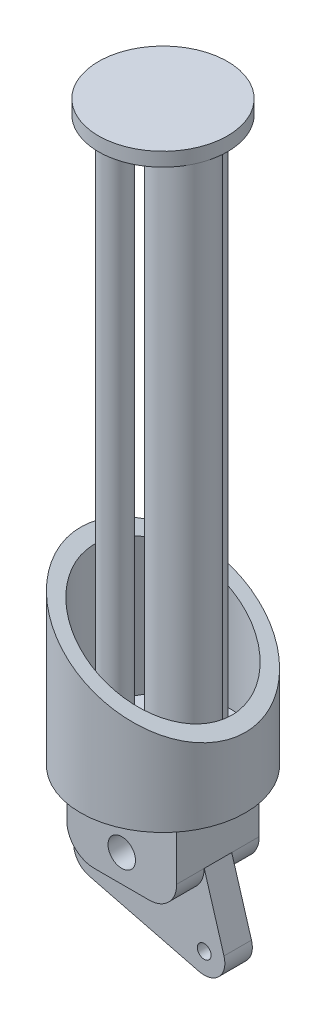
ISO-10303-21;
HEADER;
FILE_DESCRIPTION(('STEP AP214'),'2;1');
FILE_NAME('part.step','',(''),(''),'','','');
FILE_SCHEMA(('AUTOMOTIVE_DESIGN { 1 0 10303 214 1 1 1 1 }'));
ENDSEC;
DATA;
#1=APPLICATION_CONTEXT('core data for automotive mechanical design processes');
#2=APPLICATION_PROTOCOL_DEFINITION('international standard','automotive_design',2000,#1);
#3=PRODUCT_CONTEXT('',#1,'mechanical');
#4=PRODUCT('Part','Part','',(#3));
#5=PRODUCT_RELATED_PRODUCT_CATEGORY('part','',(#4));
#6=PRODUCT_DEFINITION_FORMATION('','',#4);
#7=PRODUCT_DEFINITION_CONTEXT('part definition',#1,'design');
#8=PRODUCT_DEFINITION('design','',#6,#7);
#9=PRODUCT_DEFINITION_SHAPE('','',#8);
#10=(LENGTH_UNIT() NAMED_UNIT(*) SI_UNIT(.MILLI.,.METRE.));
#11=(NAMED_UNIT(*) PLANE_ANGLE_UNIT() SI_UNIT($,.RADIAN.));
#12=(NAMED_UNIT(*) SI_UNIT($,.STERADIAN.) SOLID_ANGLE_UNIT());
#13=UNCERTAINTY_MEASURE_WITH_UNIT(LENGTH_MEASURE(1.E-05),#10,'distance_accuracy_value','');
#14=(GEOMETRIC_REPRESENTATION_CONTEXT(3) GLOBAL_UNCERTAINTY_ASSIGNED_CONTEXT((#13)) GLOBAL_UNIT_ASSIGNED_CONTEXT((#10,
#11,#12)) REPRESENTATION_CONTEXT('',''));
#15=CARTESIAN_POINT('',(0.,0.,0.));
#16=DIRECTION('',(0.,0.,1.));
#17=DIRECTION('',(1.,0.,0.));
#18=AXIS2_PLACEMENT_3D('',#15,#16,#17);
#19=CARTESIAN_POINT('',(0.,-30.,0.));
#20=DIRECTION('',(0.,-1.,0.));
#21=DIRECTION('',(0.,0.,-1.));
#22=AXIS2_PLACEMENT_3D('',#19,#20,#21);
#23=PLANE('',#22);
#24=DIRECTION('',(0.,0.,-1.));
#25=VECTOR('',#24,1.);
#26=CARTESIAN_POINT('',(-10.,-30.,-15.));
#27=LINE('',#26,#25);
#28=CARTESIAN_POINT('',(-10.,-30.,15.));
#29=VERTEX_POINT('',#28);
#30=CARTESIAN_POINT('',(-10.,-30.,5.));
#31=VERTEX_POINT('',#30);
#32=EDGE_CURVE('E291',#29,#31,#27,.T.);
#33=ORIENTED_EDGE('',*,*,#32,.T.);
#34=DIRECTION('',(1.,0.,0.));
#35=VECTOR('',#34,1.);
#36=CARTESIAN_POINT('',(0.,-30.,5.));
#37=LINE('',#36,#35);
#38=CARTESIAN_POINT('',(9.99999999999999,-30.,5.));
#39=VERTEX_POINT('',#38);
#40=EDGE_CURVE('E158',#31,#39,#37,.T.);
#41=ORIENTED_EDGE('',*,*,#40,.T.);
#42=DIRECTION('',(0.,0.,1.));
#43=VECTOR('',#42,1.);
#44=CARTESIAN_POINT('',(9.99999999999999,-30.,15.));
#45=LINE('',#44,#43);
#46=CARTESIAN_POINT('',(9.99999999999999,-30.,15.));
#47=VERTEX_POINT('',#46);
#48=EDGE_CURVE('E286',#39,#47,#45,.T.);
#49=ORIENTED_EDGE('',*,*,#48,.T.);
#50=DIRECTION('',(-1.,0.,0.));
#51=VECTOR('',#50,1.);
#52=CARTESIAN_POINT('',(20.,-30.,15.));
#53=LINE('',#52,#51);
#54=EDGE_CURVE('E261',#47,#29,#53,.T.);
#55=ORIENTED_EDGE('',*,*,#54,.T.);
#56=EDGE_LOOP('',(#33,#41,#49,#55));
#57=FACE_BOUND('',#56,.T.);
#58=ADVANCED_FACE('F40',(#57),#23,.T.);
#59=CARTESIAN_POINT('',(-10.,-20.,0.));
#60=DIRECTION('',(0.,0.,1.));
#61=DIRECTION('',(1.,0.,0.));
#62=AXIS2_PLACEMENT_3D('',#59,#60,#61);
#63=CYLINDRICAL_SURFACE('',#62,10.);
#64=DIRECTION('',(0.,0.,-1.));
#65=VECTOR('',#64,1.);
#66=CARTESIAN_POINT('',(-20.,-20.,15.));
#67=LINE('',#66,#65);
#68=CARTESIAN_POINT('',(-20.,-20.,5.));
#69=VERTEX_POINT('',#68);
#70=CARTESIAN_POINT('',(-20.,-20.,15.));
#71=VERTEX_POINT('',#70);
#72=EDGE_CURVE('E298',#69,#71,#67,.F.);
#73=ORIENTED_EDGE('',*,*,#72,.F.);
#74=CARTESIAN_POINT('',(-10.,-20.,5.));
#75=DIRECTION('',(0.,0.,-1.));
#76=DIRECTION('',(-1.,0.,0.));
#77=AXIS2_PLACEMENT_3D('',#74,#75,#76);
#78=CIRCLE('',#77,10.);
#79=EDGE_CURVE('E217',#69,#31,#78,.F.);
#80=ORIENTED_EDGE('',*,*,#79,.T.);
#81=ORIENTED_EDGE('',*,*,#32,.F.);
#82=CARTESIAN_POINT('',(-10.,-20.,15.));
#83=DIRECTION('',(0.,0.,-1.));
#84=DIRECTION('',(-1.,0.,0.));
#85=AXIS2_PLACEMENT_3D('',#82,#83,#84);
#86=CIRCLE('',#85,10.);
#87=EDGE_CURVE('E303',#71,#29,#86,.F.);
#88=ORIENTED_EDGE('',*,*,#87,.F.);
#89=EDGE_LOOP('',(#73,#80,#81,#88));
#90=FACE_BOUND('',#89,.T.);
#91=ADVANCED_FACE('F344',(#90),#63,.T.);
#92=CARTESIAN_POINT('',(9.99999999999999,-20.,0.));
#93=DIRECTION('',(0.,0.,-1.));
#94=DIRECTION('',(-1.,0.,0.));
#95=AXIS2_PLACEMENT_3D('',#92,#93,#94);
#96=CYLINDRICAL_SURFACE('',#95,10.);
#97=ORIENTED_EDGE('',*,*,#48,.F.);
#98=CARTESIAN_POINT('',(9.99999999999999,-20.,5.));
#99=DIRECTION('',(0.,0.,-1.));
#100=DIRECTION('',(-1.,0.,0.));
#101=AXIS2_PLACEMENT_3D('',#98,#99,#100);
#102=CIRCLE('',#101,10.);
#103=CARTESIAN_POINT('',(20.,-20.,5.));
#104=VERTEX_POINT('',#103);
#105=EDGE_CURVE('E48',#39,#104,#102,.F.);
#106=ORIENTED_EDGE('',*,*,#105,.T.);
#107=DIRECTION('',(0.,0.,1.));
#108=VECTOR('',#107,1.);
#109=CARTESIAN_POINT('',(20.,-20.,-15.));
#110=LINE('',#109,#108);
#111=CARTESIAN_POINT('',(20.,-20.,15.));
#112=VERTEX_POINT('',#111);
#113=EDGE_CURVE('E306',#112,#104,#110,.F.);
#114=ORIENTED_EDGE('',*,*,#113,.F.);
#115=CARTESIAN_POINT('',(9.99999999999999,-20.,15.));
#116=DIRECTION('',(0.,0.,-1.));
#117=DIRECTION('',(-1.,0.,0.));
#118=AXIS2_PLACEMENT_3D('',#115,#116,#117);
#119=CIRCLE('',#118,10.);
#120=EDGE_CURVE('E63',#47,#112,#119,.F.);
#121=ORIENTED_EDGE('',*,*,#120,.F.);
#122=EDGE_LOOP('',(#97,#106,#114,#121));
#123=FACE_BOUND('',#122,.T.);
#124=ADVANCED_FACE('F323',(#123),#96,.T.);
#125=CARTESIAN_POINT('',(0.,60.,0.));
#126=DIRECTION('',(0.,-1.,0.));
#127=DIRECTION('',(0.,0.,-1.));
#128=AXIS2_PLACEMENT_3D('',#125,#126,#127);
#129=CYLINDRICAL_SURFACE('',#128,30.);
#130=CARTESIAN_POINT('',(0.,0.,0.));
#131=DIRECTION('',(0.,1.,0.));
#132=DIRECTION('',(0.,0.,1.));
#133=AXIS2_PLACEMENT_3D('',#130,#131,#132);
#134=CIRCLE('',#133,30.);
#135=CARTESIAN_POINT('',(0.,0.,30.));
#136=VERTEX_POINT('',#135);
#137=EDGE_CURVE('E283',#136,#136,#134,.T.);
#138=ORIENTED_EDGE('',*,*,#137,.T.);
#139=EDGE_LOOP('',(#138));
#140=FACE_BOUND('',#139,.T.);
#141=CARTESIAN_POINT('',(0.,42.6794919243115,0.));
#142=DIRECTION('',(-0.499999999999995,-0.866025403784442,0.));
#143=DIRECTION('',(0.866025403784442,-0.499999999999995,0.));
#144=AXIS2_PLACEMENT_3D('',#141,#142,#143);
#145=ELLIPSE('',#144,34.6410161513774,30.);
#146=CARTESIAN_POINT('',(30.,25.3589838486229,0.));
#147=VERTEX_POINT('',#146);
#148=EDGE_CURVE('E248',#147,#147,#145,.T.);
#149=ORIENTED_EDGE('',*,*,#148,.T.);
#150=EDGE_LOOP('',(#149));
#151=FACE_BOUND('',#150,.T.);
#152=ADVANCED_FACE('F545',(#140,#151),#129,.T.);
#153=CARTESIAN_POINT('',(0.,0.,0.));
#154=DIRECTION('',(0.,1.,0.));
#155=DIRECTION('',(0.,0.,1.));
#156=AXIS2_PLACEMENT_3D('',#153,#154,#155);
#157=PLANE('',#156);
#158=ORIENTED_EDGE('',*,*,#137,.F.);
#159=EDGE_LOOP('',(#158));
#160=FACE_BOUND('',#159,.T.);
#161=DIRECTION('',(0.,0.,-1.));
#162=VECTOR('',#161,1.);
#163=CARTESIAN_POINT('',(-20.,0.,-15.));
#164=LINE('',#163,#162);
#165=CARTESIAN_POINT('',(-20.,0.,15.));
#166=VERTEX_POINT('',#165);
#167=CARTESIAN_POINT('',(-20.,0.,-15.));
#168=VERTEX_POINT('',#167);
#169=EDGE_CURVE('E257',#166,#168,#164,.T.);
#170=ORIENTED_EDGE('',*,*,#169,.F.);
#171=DIRECTION('',(-1.,0.,0.));
#172=VECTOR('',#171,1.);
#173=CARTESIAN_POINT('',(20.,0.,15.));
#174=LINE('',#173,#172);
#175=CARTESIAN_POINT('',(20.,0.,15.));
#176=VERTEX_POINT('',#175);
#177=EDGE_CURVE('E262',#176,#166,#174,.T.);
#178=ORIENTED_EDGE('',*,*,#177,.F.);
#179=DIRECTION('',(0.,0.,1.));
#180=VECTOR('',#179,1.);
#181=CARTESIAN_POINT('',(20.,0.,-15.));
#182=LINE('',#181,#180);
#183=CARTESIAN_POINT('',(20.,0.,-15.));
#184=VERTEX_POINT('',#183);
#185=EDGE_CURVE('E271',#184,#176,#182,.T.);
#186=ORIENTED_EDGE('',*,*,#185,.F.);
#187=DIRECTION('',(1.,0.,0.));
#188=VECTOR('',#187,1.);
#189=CARTESIAN_POINT('',(20.,0.,-15.));
#190=LINE('',#189,#188);
#191=EDGE_CURVE('E268',#168,#184,#190,.T.);
#192=ORIENTED_EDGE('',*,*,#191,.F.);
#193=EDGE_LOOP('',(#170,#178,#186,#192));
#194=FACE_BOUND('',#193,.T.);
#195=ADVANCED_FACE('F333',(#160,#194),#157,.F.);
#196=CARTESIAN_POINT('',(-20.,-30.,-15.));
#197=DIRECTION('',(1.,0.,0.));
#198=DIRECTION('',(0.,0.,-1.));
#199=AXIS2_PLACEMENT_3D('',#196,#197,#198);
#200=PLANE('',#199);
#201=CARTESIAN_POINT('',(-20.,-20.,-15.));
#202=VERTEX_POINT('',#201);
#203=CARTESIAN_POINT('',(-20.,-20.,-5.));
#204=VERTEX_POINT('',#203);
#205=EDGE_CURVE('E299',#202,#204,#67,.F.);
#206=ORIENTED_EDGE('',*,*,#205,.T.);
#207=DIRECTION('',(0.,1.,0.));
#208=VECTOR('',#207,1.);
#209=CARTESIAN_POINT('',(-20.,-30.,-5.));
#210=LINE('',#209,#208);
#211=CARTESIAN_POINT('',(-20.,-18.6545928830374,-5.));
#212=VERTEX_POINT('',#211);
#213=EDGE_CURVE('E226',#204,#212,#210,.T.);
#214=ORIENTED_EDGE('',*,*,#213,.T.);
#215=DIRECTION('',(0.,0.,1.));
#216=VECTOR('',#215,1.);
#217=CARTESIAN_POINT('',(-20.,-18.6545928830374,-5.));
#218=LINE('',#217,#216);
#219=CARTESIAN_POINT('',(-20.,-18.6545928830374,5.));
#220=VERTEX_POINT('',#219);
#221=EDGE_CURVE('E205',#212,#220,#218,.T.);
#222=ORIENTED_EDGE('',*,*,#221,.T.);
#223=DIRECTION('',(0.,1.,0.));
#224=VECTOR('',#223,1.);
#225=CARTESIAN_POINT('',(-20.,-30.,5.));
#226=LINE('',#225,#224);
#227=EDGE_CURVE('E220',#69,#220,#226,.T.);
#228=ORIENTED_EDGE('',*,*,#227,.F.);
#229=ORIENTED_EDGE('',*,*,#72,.T.);
#230=DIRECTION('',(0.,1.,0.));
#231=VECTOR('',#230,1.);
#232=CARTESIAN_POINT('',(-20.,-30.,15.));
#233=LINE('',#232,#231);
#234=EDGE_CURVE('E265',#71,#166,#233,.T.);
#235=ORIENTED_EDGE('',*,*,#234,.T.);
#236=ORIENTED_EDGE('',*,*,#169,.T.);
#237=DIRECTION('',(0.,1.,0.));
#238=VECTOR('',#237,1.);
#239=CARTESIAN_POINT('',(-20.,-30.,-15.));
#240=LINE('',#239,#238);
#241=EDGE_CURVE('E281',#202,#168,#240,.T.);
#242=ORIENTED_EDGE('',*,*,#241,.F.);
#243=EDGE_LOOP('',(#206,#214,#222,#228,#229,#235,#236,#242));
#244=FACE_BOUND('',#243,.T.);
#245=ADVANCED_FACE('F337',(#244),#200,.F.);
#246=CARTESIAN_POINT('',(20.,-30.,-15.));
#247=DIRECTION('',(0.,0.,1.));
#248=DIRECTION('',(1.,0.,0.));
#249=AXIS2_PLACEMENT_3D('',#246,#247,#248);
#250=PLANE('',#249);
#251=CARTESIAN_POINT('',(0.,-20.,-15.));
#252=DIRECTION('',(0.,0.,1.));
#253=DIRECTION('',(1.,0.,0.));
#254=AXIS2_PLACEMENT_3D('',#251,#252,#253);
#255=CIRCLE('',#254,5.);
#256=CARTESIAN_POINT('',(5.,-20.,-15.));
#257=VERTEX_POINT('',#256);
#258=EDGE_CURVE('E254',#257,#257,#255,.T.);
#259=ORIENTED_EDGE('',*,*,#258,.T.);
#260=EDGE_LOOP('',(#259));
#261=FACE_BOUND('',#260,.T.);
#262=DIRECTION('',(1.,0.,0.));
#263=VECTOR('',#262,1.);
#264=CARTESIAN_POINT('',(20.,-30.,-15.));
#265=LINE('',#264,#263);
#266=CARTESIAN_POINT('',(-10.,-30.,-15.));
#267=VERTEX_POINT('',#266);
#268=CARTESIAN_POINT('',(9.99999999999999,-30.,-15.));
#269=VERTEX_POINT('',#268);
#270=EDGE_CURVE('E258',#267,#269,#265,.T.);
#271=ORIENTED_EDGE('',*,*,#270,.F.);
#272=CARTESIAN_POINT('',(-10.,-20.,-15.));
#273=DIRECTION('',(0.,0.,1.));
#274=DIRECTION('',(1.,0.,0.));
#275=AXIS2_PLACEMENT_3D('',#272,#273,#274);
#276=CIRCLE('',#275,10.);
#277=EDGE_CURVE('E296',#267,#202,#276,.F.);
#278=ORIENTED_EDGE('',*,*,#277,.T.);
#279=ORIENTED_EDGE('',*,*,#241,.T.);
#280=ORIENTED_EDGE('',*,*,#191,.T.);
#281=DIRECTION('',(0.,1.,0.));
#282=VECTOR('',#281,1.);
#283=CARTESIAN_POINT('',(20.,-30.,-15.));
#284=LINE('',#283,#282);
#285=CARTESIAN_POINT('',(20.,-20.,-15.));
#286=VERTEX_POINT('',#285);
#287=EDGE_CURVE('E279',#286,#184,#284,.T.);
#288=ORIENTED_EDGE('',*,*,#287,.F.);
#289=CARTESIAN_POINT('',(9.99999999999999,-20.,-15.));
#290=DIRECTION('',(0.,0.,1.));
#291=DIRECTION('',(1.,0.,0.));
#292=AXIS2_PLACEMENT_3D('',#289,#290,#291);
#293=CIRCLE('',#292,10.);
#294=EDGE_CURVE('E294',#286,#269,#293,.F.);
#295=ORIENTED_EDGE('',*,*,#294,.T.);
#296=EDGE_LOOP('',(#271,#278,#279,#280,#288,#295));
#297=FACE_BOUND('',#296,.T.);
#298=ADVANCED_FACE('F370',(#261,#297),#250,.F.);
#299=CARTESIAN_POINT('',(20.,-30.,-15.));
#300=DIRECTION('',(-1.,0.,0.));
#301=DIRECTION('',(0.,0.,1.));
#302=AXIS2_PLACEMENT_3D('',#299,#300,#301);
#303=PLANE('',#302);
#304=DIRECTION('',(0.,1.,0.));
#305=VECTOR('',#304,1.);
#306=CARTESIAN_POINT('',(20.,-30.,15.));
#307=LINE('',#306,#305);
#308=EDGE_CURVE('E277',#112,#176,#307,.T.);
#309=ORIENTED_EDGE('',*,*,#308,.F.);
#310=ORIENTED_EDGE('',*,*,#113,.T.);
#311=DIRECTION('',(0.,0.,1.));
#312=VECTOR('',#311,1.);
#313=CARTESIAN_POINT('',(20.,-20.,-5.));
#314=LINE('',#313,#312);
#315=CARTESIAN_POINT('',(20.,-20.,-5.));
#316=VERTEX_POINT('',#315);
#317=EDGE_CURVE('E185',#316,#104,#314,.T.);
#318=ORIENTED_EDGE('',*,*,#317,.F.);
#319=EDGE_CURVE('E305',#316,#286,#110,.F.);
#320=ORIENTED_EDGE('',*,*,#319,.T.);
#321=ORIENTED_EDGE('',*,*,#287,.T.);
#322=ORIENTED_EDGE('',*,*,#185,.T.);
#323=EDGE_LOOP('',(#309,#310,#318,#320,#321,#322));
#324=FACE_BOUND('',#323,.T.);
#325=ADVANCED_FACE('F326',(#324),#303,.F.);
#326=CARTESIAN_POINT('',(20.,-30.,15.));
#327=DIRECTION('',(0.,0.,-1.));
#328=DIRECTION('',(-1.,0.,0.));
#329=AXIS2_PLACEMENT_3D('',#326,#327,#328);
#330=PLANE('',#329);
#331=CARTESIAN_POINT('',(0.,-20.,15.));
#332=DIRECTION('',(0.,0.,1.));
#333=DIRECTION('',(1.,0.,0.));
#334=AXIS2_PLACEMENT_3D('',#331,#332,#333);
#335=CIRCLE('',#334,5.);
#336=CARTESIAN_POINT('',(5.,-20.,15.));
#337=VERTEX_POINT('',#336);
#338=EDGE_CURVE('E251',#337,#337,#335,.T.);
#339=ORIENTED_EDGE('',*,*,#338,.F.);
#340=EDGE_LOOP('',(#339));
#341=FACE_BOUND('',#340,.T.);
#342=ORIENTED_EDGE('',*,*,#234,.F.);
#343=ORIENTED_EDGE('',*,*,#87,.T.);
#344=ORIENTED_EDGE('',*,*,#54,.F.);
#345=ORIENTED_EDGE('',*,*,#120,.T.);
#346=ORIENTED_EDGE('',*,*,#308,.T.);
#347=ORIENTED_EDGE('',*,*,#177,.T.);
#348=EDGE_LOOP('',(#342,#343,#344,#345,#346,#347));
#349=FACE_BOUND('',#348,.T.);
#350=ADVANCED_FACE('F330',(#341,#349),#330,.F.);
#351=DIRECTION('',(1.,0.,0.));
#352=VECTOR('',#351,1.);
#353=CARTESIAN_POINT('',(0.,-30.,-5.));
#354=LINE('',#353,#352);
#355=CARTESIAN_POINT('',(-10.,-30.,-5.));
#356=VERTEX_POINT('',#355);
#357=CARTESIAN_POINT('',(9.99999999999999,-30.,-5.));
#358=VERTEX_POINT('',#357);
#359=EDGE_CURVE('E222',#356,#358,#354,.T.);
#360=ORIENTED_EDGE('',*,*,#359,.F.);
#361=EDGE_CURVE('E290',#356,#267,#27,.T.);
#362=ORIENTED_EDGE('',*,*,#361,.T.);
#363=ORIENTED_EDGE('',*,*,#270,.T.);
#364=EDGE_CURVE('E287',#269,#358,#45,.T.);
#365=ORIENTED_EDGE('',*,*,#364,.T.);
#366=EDGE_LOOP('',(#360,#362,#363,#365));
#367=FACE_BOUND('',#366,.T.);
#368=ADVANCED_FACE('F364',(#367),#23,.T.);
#369=CARTESIAN_POINT('',(-10.,-20.,-5.));
#370=DIRECTION('',(0.,0.,-1.));
#371=DIRECTION('',(-1.,0.,0.));
#372=AXIS2_PLACEMENT_3D('',#369,#370,#371);
#373=CIRCLE('',#372,10.);
#374=EDGE_CURVE('E224',#204,#356,#373,.F.);
#375=ORIENTED_EDGE('',*,*,#374,.F.);
#376=ORIENTED_EDGE('',*,*,#205,.F.);
#377=ORIENTED_EDGE('',*,*,#277,.F.);
#378=ORIENTED_EDGE('',*,*,#361,.F.);
#379=EDGE_LOOP('',(#375,#376,#377,#378));
#380=FACE_BOUND('',#379,.T.);
#381=ADVANCED_FACE('F360',(#380),#63,.T.);
#382=CARTESIAN_POINT('',(9.99999999999999,-20.,-5.));
#383=DIRECTION('',(0.,0.,-1.));
#384=DIRECTION('',(-1.,0.,0.));
#385=AXIS2_PLACEMENT_3D('',#382,#383,#384);
#386=CIRCLE('',#385,10.);
#387=EDGE_CURVE('E11',#358,#316,#386,.F.);
#388=ORIENTED_EDGE('',*,*,#387,.F.);
#389=ORIENTED_EDGE('',*,*,#364,.F.);
#390=ORIENTED_EDGE('',*,*,#294,.F.);
#391=ORIENTED_EDGE('',*,*,#319,.F.);
#392=EDGE_LOOP('',(#388,#389,#390,#391));
#393=FACE_BOUND('',#392,.T.);
#394=ADVANCED_FACE('F42',(#393),#96,.T.);
#395=CARTESIAN_POINT('',(0.,-20.,-30.));
#396=DIRECTION('',(0.,0.,1.));
#397=DIRECTION('',(1.,0.,0.));
#398=AXIS2_PLACEMENT_3D('',#395,#396,#397);
#399=CYLINDRICAL_SURFACE('',#398,5.);
#400=CARTESIAN_POINT('',(5.,-20.,15.));
#401=CARTESIAN_POINT('',(5.,-20.,14.6875));
#402=CARTESIAN_POINT('',(5.,-20.,14.375));
#403=CARTESIAN_POINT('',(5.,-20.,13.75));
#404=CARTESIAN_POINT('',(5.,-20.,13.4375));
#405=CARTESIAN_POINT('',(5.,-20.,12.8125));
#406=CARTESIAN_POINT('',(5.,-20.,12.5));
#407=CARTESIAN_POINT('',(5.,-20.,11.875));
#408=CARTESIAN_POINT('',(5.,-20.,11.5625));
#409=CARTESIAN_POINT('',(5.,-20.,10.9375));
#410=CARTESIAN_POINT('',(5.,-20.,10.625));
#411=CARTESIAN_POINT('',(5.,-20.,9.99999999999999));
#412=CARTESIAN_POINT('',(5.,-20.,9.68749999999999));
#413=CARTESIAN_POINT('',(5.,-20.,9.06249999999999));
#414=CARTESIAN_POINT('',(5.,-20.,8.74999999999999));
#415=CARTESIAN_POINT('',(5.,-20.,8.12499999999999));
#416=CARTESIAN_POINT('',(5.,-20.,7.81249999999999));
#417=CARTESIAN_POINT('',(5.,-20.,7.18749999999999));
#418=CARTESIAN_POINT('',(5.,-20.,6.87499999999999));
#419=CARTESIAN_POINT('',(5.,-20.,6.24999999999999));
#420=CARTESIAN_POINT('',(5.,-20.,5.93749999999999));
#421=CARTESIAN_POINT('',(5.,-20.,5.31249999999999));
#422=CARTESIAN_POINT('',(5.,-20.,4.99999999999999));
#423=CARTESIAN_POINT('',(5.,-20.,4.37499999999999));
#424=CARTESIAN_POINT('',(5.,-20.,4.06249999999999));
#425=CARTESIAN_POINT('',(5.,-20.,3.43749999999999));
#426=CARTESIAN_POINT('',(5.,-20.,3.12499999999999));
#427=CARTESIAN_POINT('',(5.,-20.,2.49999999999999));
#428=CARTESIAN_POINT('',(5.,-20.,2.18749999999999));
#429=CARTESIAN_POINT('',(5.,-20.,1.5625));
#430=CARTESIAN_POINT('',(5.,-20.,1.25));
#431=CARTESIAN_POINT('',(5.,-20.,0.624999999999997));
#432=CARTESIAN_POINT('',(5.,-20.,0.312499999999997));
#433=CARTESIAN_POINT('',(5.,-20.,-0.312500000000004));
#434=CARTESIAN_POINT('',(5.,-20.,-0.625000000000004));
#435=CARTESIAN_POINT('',(5.,-20.,-1.25));
#436=CARTESIAN_POINT('',(5.,-20.,-1.5625));
#437=CARTESIAN_POINT('',(5.,-20.,-2.18750000000001));
#438=CARTESIAN_POINT('',(5.,-20.,-2.50000000000001));
#439=CARTESIAN_POINT('',(5.,-20.,-3.12500000000001));
#440=CARTESIAN_POINT('',(5.,-20.,-3.43750000000001));
#441=CARTESIAN_POINT('',(5.,-20.,-4.06250000000001));
#442=CARTESIAN_POINT('',(5.,-20.,-4.375));
#443=CARTESIAN_POINT('',(5.,-20.,-5.));
#444=CARTESIAN_POINT('',(5.,-20.,-5.3125));
#445=CARTESIAN_POINT('',(5.,-20.,-5.93750000000001));
#446=CARTESIAN_POINT('',(5.,-20.,-6.25000000000001));
#447=CARTESIAN_POINT('',(5.,-20.,-6.87500000000001));
#448=CARTESIAN_POINT('',(5.,-20.,-7.18750000000001));
#449=CARTESIAN_POINT('',(5.,-20.,-7.81250000000001));
#450=CARTESIAN_POINT('',(5.,-20.,-8.12500000000001));
#451=CARTESIAN_POINT('',(5.,-20.,-8.75000000000001));
#452=CARTESIAN_POINT('',(5.,-20.,-9.06250000000001));
#453=CARTESIAN_POINT('',(5.,-20.,-9.68750000000001));
#454=CARTESIAN_POINT('',(5.,-20.,-10.));
#455=CARTESIAN_POINT('',(5.,-20.,-10.625));
#456=CARTESIAN_POINT('',(5.,-20.,-10.9375));
#457=CARTESIAN_POINT('',(5.,-20.,-11.5625));
#458=CARTESIAN_POINT('',(5.,-20.,-11.875));
#459=CARTESIAN_POINT('',(5.,-20.,-12.5));
#460=CARTESIAN_POINT('',(5.,-20.,-12.8125));
#461=CARTESIAN_POINT('',(5.,-20.,-13.4375));
#462=CARTESIAN_POINT('',(5.,-20.,-13.75));
#463=CARTESIAN_POINT('',(5.,-20.,-14.375));
#464=CARTESIAN_POINT('',(5.,-20.,-14.6875));
#465=CARTESIAN_POINT('',(5.,-20.,-15.));
#466=B_SPLINE_CURVE_WITH_KNOTS('',3,(#400,#401,#402,#403,#404,#405,#406,#407,#408,#409,#410,
#411,#412,#413,#414,#415,#416,#417,#418,#419,#420,#421,#422,#423,#424,#425,#426,#427,#428,#429,
#430,#431,#432,#433,#434,#435,#436,#437,#438,#439,#440,#441,#442,#443,#444,#445,#446,#447,#448,
#449,#450,#451,#452,#453,#454,#455,#456,#457,#458,#459,#460,#461,#462,#463,#464,#465),
.UNSPECIFIED.,.F.,.F.,(4,2,2,2,2,2,2,2,2,2,2,2,2,2,2,2,2,2,2,2,2,2,2,2,2,2,2,2,2,2,2,2,4),(0.,
0.937500000000001,1.875,2.8125,3.75,4.6875,5.625,6.5625,7.5,8.4375,9.375,10.3125,11.25,12.1875,
13.125,14.0625,15.,15.9375,16.875,17.8125,18.75,19.6875,20.625,21.5625,22.5,23.4375,24.375,
25.3125,26.25,27.1875,28.125,29.0625,30.),.UNSPECIFIED.);
#467=EDGE_CURVE('BSEAM397',#337,#257,#466,.T.);
#468=ORIENTED_EDGE('',*,*,#338,.T.);
#469=ORIENTED_EDGE('',*,*,#258,.F.);
#470=ORIENTED_EDGE('',*,*,#467,.T.);
#471=ORIENTED_EDGE('',*,*,#467,.F.);
#472=EDGE_LOOP('',(#468,#470,#469,#471));
#473=FACE_BOUND('',#472,.T.);
#474=ADVANCED_FACE('F397',(#473),#399,.F.);
#475=CARTESIAN_POINT('',(-30.,60.,-30.));
#476=DIRECTION('',(-0.499999999999995,-0.866025403784442,0.));
#477=DIRECTION('',(0.866025403784442,-0.499999999999995,0.));
#478=AXIS2_PLACEMENT_3D('',#475,#476,#477);
#479=PLANE('',#478);
#480=CARTESIAN_POINT('',(0.,42.6794919243115,0.));
#481=DIRECTION('',(-0.499999999999995,-0.866025403784442,0.));
#482=DIRECTION('',(0.866025403784442,-0.499999999999995,0.));
#483=AXIS2_PLACEMENT_3D('',#480,#481,#482);
#484=ELLIPSE('',#483,28.8675134594812,25.);
#485=CARTESIAN_POINT('',(25.,28.245735194571,0.));
#486=VERTEX_POINT('',#485);
#487=EDGE_CURVE('E247',#486,#486,#484,.T.);
#488=ORIENTED_EDGE('',*,*,#487,.T.);
#489=EDGE_LOOP('',(#488));
#490=FACE_BOUND('',#489,.T.);
#491=ORIENTED_EDGE('',*,*,#148,.F.);
#492=EDGE_LOOP('',(#491));
#493=FACE_BOUND('',#492,.T.);
#494=ADVANCED_FACE('F400',(#490,#493),#479,.F.);
#495=CARTESIAN_POINT('',(0.,60.,0.));
#496=DIRECTION('',(0.,-1.,0.));
#497=DIRECTION('',(0.,0.,-1.));
#498=AXIS2_PLACEMENT_3D('',#495,#496,#497);
#499=CYLINDRICAL_SURFACE('',#498,25.);
#500=CARTESIAN_POINT('',(0.,5.,0.));
#501=DIRECTION('',(0.,-1.,0.));
#502=DIRECTION('',(0.,0.,-1.));
#503=AXIS2_PLACEMENT_3D('',#500,#501,#502);
#504=CIRCLE('',#503,25.);
#505=CARTESIAN_POINT('',(0.,5.,-25.));
#506=VERTEX_POINT('',#505);
#507=EDGE_CURVE('E244',#506,#506,#504,.T.);
#508=ORIENTED_EDGE('',*,*,#507,.T.);
#509=EDGE_LOOP('',(#508));
#510=FACE_BOUND('',#509,.T.);
#511=ORIENTED_EDGE('',*,*,#487,.F.);
#512=EDGE_LOOP('',(#511));
#513=FACE_BOUND('',#512,.T.);
#514=ADVANCED_FACE('F406',(#510,#513),#499,.F.);
#515=CARTESIAN_POINT('',(0.,5.,0.));
#516=DIRECTION('',(0.,-1.,0.));
#517=DIRECTION('',(0.,0.,-1.));
#518=AXIS2_PLACEMENT_3D('',#515,#516,#517);
#519=PLANE('',#518);
#520=CARTESIAN_POINT('',(-12.5,5.,5.));
#521=DIRECTION('',(0.,-1.,0.));
#522=DIRECTION('',(0.,0.,-1.));
#523=AXIS2_PLACEMENT_3D('',#520,#521,#522);
#524=CIRCLE('',#523,5.);
#525=CARTESIAN_POINT('',(-12.5,5.,0.));
#526=VERTEX_POINT('',#525);
#527=EDGE_CURVE('E317',#526,#526,#524,.F.);
#528=ORIENTED_EDGE('',*,*,#527,.F.);
#529=EDGE_LOOP('',(#528));
#530=FACE_BOUND('',#529,.T.);
#531=CARTESIAN_POINT('',(12.5,5.,5.));
#532=DIRECTION('',(0.,-1.,0.));
#533=DIRECTION('',(0.,0.,-1.));
#534=AXIS2_PLACEMENT_3D('',#531,#532,#533);
#535=CIRCLE('',#534,10.);
#536=CARTESIAN_POINT('',(12.5,5.,-5.));
#537=VERTEX_POINT('',#536);
#538=EDGE_CURVE('E314',#537,#537,#535,.F.);
#539=ORIENTED_EDGE('',*,*,#538,.F.);
#540=EDGE_LOOP('',(#539));
#541=FACE_BOUND('',#540,.T.);
#542=CARTESIAN_POINT('',(0.,5.,-16.650635094611));
#543=DIRECTION('',(0.,-1.,0.));
#544=DIRECTION('',(0.,0.,-1.));
#545=AXIS2_PLACEMENT_3D('',#542,#543,#544);
#546=CIRCLE('',#545,5.);
#547=CARTESIAN_POINT('',(0.,5.,-21.650635094611));
#548=VERTEX_POINT('',#547);
#549=EDGE_CURVE('E309',#548,#548,#546,.F.);
#550=ORIENTED_EDGE('',*,*,#549,.F.);
#551=EDGE_LOOP('',(#550));
#552=FACE_BOUND('',#551,.T.);
#553=ORIENTED_EDGE('',*,*,#507,.F.);
#554=EDGE_LOOP('',(#553));
#555=FACE_BOUND('',#554,.T.);
#556=ADVANCED_FACE('F412',(#530,#541,#552,#555),#519,.F.);
#557=CARTESIAN_POINT('',(0.,205.,-16.650635094611));
#558=DIRECTION('',(0.,-1.,0.));
#559=DIRECTION('',(0.,0.,-1.));
#560=AXIS2_PLACEMENT_3D('',#557,#558,#559);
#561=CYLINDRICAL_SURFACE('',#560,5.);
#562=CARTESIAN_POINT('',(0.,205.,-16.650635094611));
#563=DIRECTION('',(0.,1.,0.));
#564=DIRECTION('',(0.,0.,1.));
#565=AXIS2_PLACEMENT_3D('',#562,#563,#564);
#566=CIRCLE('',#565,5.);
#567=CARTESIAN_POINT('',(0.,205.,-11.650635094611));
#568=VERTEX_POINT('',#567);
#569=EDGE_CURVE('E241',#568,#568,#566,.T.);
#570=ORIENTED_EDGE('',*,*,#569,.F.);
#571=EDGE_LOOP('',(#570));
#572=FACE_BOUND('',#571,.T.);
#573=ORIENTED_EDGE('',*,*,#549,.T.);
#574=EDGE_LOOP('',(#573));
#575=FACE_BOUND('',#574,.T.);
#576=ADVANCED_FACE('F416',(#572,#575),#561,.T.);
#577=CARTESIAN_POINT('',(12.5,205.,5.));
#578=DIRECTION('',(0.,-1.,0.));
#579=DIRECTION('',(0.,0.,-1.));
#580=AXIS2_PLACEMENT_3D('',#577,#578,#579);
#581=CYLINDRICAL_SURFACE('',#580,10.);
#582=CARTESIAN_POINT('',(12.5,205.,5.));
#583=DIRECTION('',(0.,1.,0.));
#584=DIRECTION('',(0.,0.,1.));
#585=AXIS2_PLACEMENT_3D('',#582,#583,#584);
#586=CIRCLE('',#585,10.);
#587=CARTESIAN_POINT('',(21.7847669088526,205.,8.71390676354103));
#588=VERTEX_POINT('',#587);
#589=EDGE_CURVE('E238',#588,#588,#586,.T.);
#590=ORIENTED_EDGE('',*,*,#589,.F.);
#591=EDGE_LOOP('',(#590));
#592=FACE_BOUND('',#591,.T.);
#593=ORIENTED_EDGE('',*,*,#538,.T.);
#594=EDGE_LOOP('',(#593));
#595=FACE_BOUND('',#594,.T.);
#596=ADVANCED_FACE('F420',(#592,#595),#581,.T.);
#597=CARTESIAN_POINT('',(-12.5,205.,5.));
#598=DIRECTION('',(0.,-1.,0.));
#599=DIRECTION('',(0.,0.,-1.));
#600=AXIS2_PLACEMENT_3D('',#597,#598,#599);
#601=CYLINDRICAL_SURFACE('',#600,5.);
#602=CARTESIAN_POINT('',(-12.5,205.,5.));
#603=DIRECTION('',(0.,1.,0.));
#604=DIRECTION('',(0.,0.,1.));
#605=AXIS2_PLACEMENT_3D('',#602,#603,#604);
#606=CIRCLE('',#605,5.);
#607=CARTESIAN_POINT('',(-12.5,205.,10.));
#608=VERTEX_POINT('',#607);
#609=EDGE_CURVE('E233',#608,#608,#606,.T.);
#610=ORIENTED_EDGE('',*,*,#609,.F.);
#611=EDGE_LOOP('',(#610));
#612=FACE_BOUND('',#611,.T.);
#613=ORIENTED_EDGE('',*,*,#527,.T.);
#614=EDGE_LOOP('',(#613));
#615=FACE_BOUND('',#614,.T.);
#616=ADVANCED_FACE('F424',(#612,#615),#601,.T.);
#617=CARTESIAN_POINT('',(0.,210.,0.));
#618=DIRECTION('',(0.,-1.,0.));
#619=DIRECTION('',(0.,0.,-1.));
#620=AXIS2_PLACEMENT_3D('',#617,#618,#619);
#621=CYLINDRICAL_SURFACE('',#620,23.4629120178363);
#622=CARTESIAN_POINT('',(0.,210.,0.));
#623=DIRECTION('',(0.,1.,0.));
#624=DIRECTION('',(0.,0.,1.));
#625=AXIS2_PLACEMENT_3D('',#622,#623,#624);
#626=CIRCLE('',#625,23.4629120178363);
#627=CARTESIAN_POINT('',(0.,210.,23.4629120178363));
#628=VERTEX_POINT('',#627);
#629=EDGE_CURVE('E230',#628,#628,#626,.T.);
#630=ORIENTED_EDGE('',*,*,#629,.F.);
#631=EDGE_LOOP('',(#630));
#632=FACE_BOUND('',#631,.T.);
#633=CARTESIAN_POINT('',(0.,205.,0.));
#634=DIRECTION('',(0.,1.,0.));
#635=DIRECTION('',(0.,0.,1.));
#636=AXIS2_PLACEMENT_3D('',#633,#634,#635);
#637=CIRCLE('',#636,23.4629120178363);
#638=EDGE_CURVE('E229',#588,#588,#637,.T.);
#639=ORIENTED_EDGE('',*,*,#638,.T.);
#640=EDGE_LOOP('',(#639));
#641=FACE_BOUND('',#640,.T.);
#642=ADVANCED_FACE('F428',(#632,#641),#621,.T.);
#643=CARTESIAN_POINT('',(0.,210.,0.));
#644=DIRECTION('',(0.,1.,0.));
#645=DIRECTION('',(0.,0.,1.));
#646=AXIS2_PLACEMENT_3D('',#643,#644,#645);
#647=PLANE('',#646);
#648=ORIENTED_EDGE('',*,*,#629,.T.);
#649=EDGE_LOOP('',(#648));
#650=FACE_BOUND('',#649,.T.);
#651=ADVANCED_FACE('F432',(#650),#647,.T.);
#652=CARTESIAN_POINT('',(0.,205.,0.));
#653=DIRECTION('',(0.,1.,0.));
#654=DIRECTION('',(0.,0.,1.));
#655=AXIS2_PLACEMENT_3D('',#652,#653,#654);
#656=PLANE('',#655);
#657=ORIENTED_EDGE('',*,*,#569,.T.);
#658=EDGE_LOOP('',(#657));
#659=FACE_BOUND('',#658,.T.);
#660=ORIENTED_EDGE('',*,*,#609,.T.);
#661=EDGE_LOOP('',(#660));
#662=FACE_BOUND('',#661,.T.);
#663=ORIENTED_EDGE('',*,*,#638,.F.);
#664=ORIENTED_EDGE('',*,*,#589,.T.);
#665=EDGE_LOOP('',(#663,#664));
#666=FACE_BOUND('',#665,.T.);
#667=ADVANCED_FACE('F434',(#659,#662,#666),#656,.F.);
#668=CARTESIAN_POINT('',(0.,0.,-5.));
#669=DIRECTION('',(0.,0.,-1.));
#670=DIRECTION('',(-1.,0.,0.));
#671=AXIS2_PLACEMENT_3D('',#668,#669,#670);
#672=PLANE('',#671);
#673=CARTESIAN_POINT('',(-20.,-36.0649440398019,-5.));
#674=DIRECTION('',(0.,0.,-1.));
#675=DIRECTION('',(-1.,0.,0.));
#676=AXIS2_PLACEMENT_3D('',#673,#674,#675);
#677=CIRCLE('',#676,2.5);
#678=CARTESIAN_POINT('',(-22.5,-36.0649440398019,-5.));
#679=VERTEX_POINT('',#678);
#680=EDGE_CURVE('E172',#679,#679,#677,.T.);
#681=ORIENTED_EDGE('',*,*,#680,.F.);
#682=EDGE_LOOP('',(#681));
#683=FACE_BOUND('',#682,.T.);
#684=CARTESIAN_POINT('',(20.,-46.1569047943084,-5.));
#685=DIRECTION('',(0.,0.,-1.));
#686=DIRECTION('',(-1.,0.,0.));
#687=AXIS2_PLACEMENT_3D('',#684,#685,#686);
#688=CIRCLE('',#687,2.5);
#689=CARTESIAN_POINT('',(17.5,-46.1569047943084,-5.));
#690=VERTEX_POINT('',#689);
#691=EDGE_CURVE('E175',#690,#690,#688,.T.);
#692=ORIENTED_EDGE('',*,*,#691,.F.);
#693=EDGE_LOOP('',(#692));
#694=FACE_BOUND('',#693,.T.);
#695=ORIENTED_EDGE('',*,*,#213,.F.);
#696=ORIENTED_EDGE('',*,*,#374,.T.);
#697=ORIENTED_EDGE('',*,*,#359,.T.);
#698=ORIENTED_EDGE('',*,*,#387,.T.);
#699=DIRECTION('',(-0.286731173240037,0.958011082551967,0.));
#700=VECTOR('',#699,1.);
#701=CARTESIAN_POINT('',(12.8618718523062,3.84953751938951,-5.));
#702=LINE('',#701,#700);
#703=CARTESIAN_POINT('',(27.1850831191397,-44.0064209950081,-5.));
#704=VERTEX_POINT('',#703);
#705=EDGE_CURVE('E154',#704,#316,#702,.T.);
#706=ORIENTED_EDGE('',*,*,#705,.F.);
#707=CARTESIAN_POINT('',(20.,-46.1569047943084,-5.));
#708=DIRECTION('',(0.,0.,-1.));
#709=DIRECTION('',(-1.,0.,0.));
#710=AXIS2_PLACEMENT_3D('',#707,#708,#709);
#711=CIRCLE('',#710,7.5);
#712=CARTESIAN_POINT('',(18.1652517847006,-53.4290227104629,-5.));
#713=VERTEX_POINT('',#712);
#714=EDGE_CURVE('E163',#704,#713,#711,.T.);
#715=ORIENTED_EDGE('',*,*,#714,.T.);
#716=DIRECTION('',(-0.969615722153938,0.24463309537325,0.));
#717=VECTOR('',#716,1.);
#718=CARTESIAN_POINT('',(-11.5862634103673,-45.9227446170697,-5.));
#719=LINE('',#718,#717);
#720=CARTESIAN_POINT('',(-21.8347482152994,-43.3370619559564,-5.));
#721=VERTEX_POINT('',#720);
#722=EDGE_CURVE('E168',#713,#721,#719,.T.);
#723=ORIENTED_EDGE('',*,*,#722,.T.);
#724=CARTESIAN_POINT('',(-20.,-36.0649440398019,-5.));
#725=DIRECTION('',(0.,0.,-1.));
#726=DIRECTION('',(-1.,0.,0.));
#727=AXIS2_PLACEMENT_3D('',#724,#725,#726);
#728=CIRCLE('',#727,7.5);
#729=CARTESIAN_POINT('',(-26.7684337010986,-32.8341074246458,-5.));
#730=VERTEX_POINT('',#729);
#731=EDGE_CURVE('E180',#721,#730,#728,.T.);
#732=ORIENTED_EDGE('',*,*,#731,.T.);
#733=DIRECTION('',(0.430778215354146,0.902457826813141,0.));
#734=VECTOR('',#733,1.);
#735=CARTESIAN_POINT('',(-9.0364584990704,4.3134530497649,-5.));
#736=LINE('',#735,#734);
#737=EDGE_CURVE('E183',#730,#212,#736,.T.);
#738=ORIENTED_EDGE('',*,*,#737,.T.);
#739=EDGE_LOOP('',(#695,#696,#697,#698,#706,#715,#723,#732,#738));
#740=FACE_BOUND('',#739,.T.);
#741=ADVANCED_FACE('F170',(#683,#694,#740),#672,.T.);
#742=CARTESIAN_POINT('',(0.,0.,5.));
#743=DIRECTION('',(0.,0.,-1.));
#744=DIRECTION('',(-1.,0.,0.));
#745=AXIS2_PLACEMENT_3D('',#742,#743,#744);
#746=PLANE('',#745);
#747=CARTESIAN_POINT('',(20.,-46.1569047943084,5.));
#748=DIRECTION('',(0.,0.,-1.));
#749=DIRECTION('',(-1.,0.,0.));
#750=AXIS2_PLACEMENT_3D('',#747,#748,#749);
#751=CIRCLE('',#750,2.5);
#752=CARTESIAN_POINT('',(17.5,-46.1569047943084,5.));
#753=VERTEX_POINT('',#752);
#754=EDGE_CURVE('E186',#753,#753,#751,.T.);
#755=ORIENTED_EDGE('',*,*,#754,.T.);
#756=EDGE_LOOP('',(#755));
#757=FACE_BOUND('',#756,.T.);
#758=CARTESIAN_POINT('',(-20.,-36.0649440398019,5.));
#759=DIRECTION('',(0.,0.,-1.));
#760=DIRECTION('',(-1.,0.,0.));
#761=AXIS2_PLACEMENT_3D('',#758,#759,#760);
#762=CIRCLE('',#761,2.5);
#763=CARTESIAN_POINT('',(-22.5,-36.0649440398019,5.));
#764=VERTEX_POINT('',#763);
#765=EDGE_CURVE('E189',#764,#764,#762,.T.);
#766=ORIENTED_EDGE('',*,*,#765,.T.);
#767=EDGE_LOOP('',(#766));
#768=FACE_BOUND('',#767,.T.);
#769=ORIENTED_EDGE('',*,*,#79,.F.);
#770=ORIENTED_EDGE('',*,*,#227,.T.);
#771=DIRECTION('',(0.430778215354146,0.902457826813141,0.));
#772=VECTOR('',#771,1.);
#773=CARTESIAN_POINT('',(-9.0364584990704,4.3134530497649,5.));
#774=LINE('',#773,#772);
#775=CARTESIAN_POINT('',(-26.7684337010986,-32.8341074246458,5.));
#776=VERTEX_POINT('',#775);
#777=EDGE_CURVE('E201',#776,#220,#774,.T.);
#778=ORIENTED_EDGE('',*,*,#777,.F.);
#779=CARTESIAN_POINT('',(-20.,-36.0649440398019,5.));
#780=DIRECTION('',(0.,0.,-1.));
#781=DIRECTION('',(-1.,0.,0.));
#782=AXIS2_PLACEMENT_3D('',#779,#780,#781);
#783=CIRCLE('',#782,7.5);
#784=CARTESIAN_POINT('',(-21.8347482152994,-43.3370619559564,5.));
#785=VERTEX_POINT('',#784);
#786=EDGE_CURVE('E198',#785,#776,#783,.T.);
#787=ORIENTED_EDGE('',*,*,#786,.F.);
#788=DIRECTION('',(-0.969615722153938,0.24463309537325,0.));
#789=VECTOR('',#788,1.);
#790=CARTESIAN_POINT('',(-11.5862634103673,-45.9227446170697,5.));
#791=LINE('',#790,#789);
#792=CARTESIAN_POINT('',(18.1652517847006,-53.4290227104629,5.));
#793=VERTEX_POINT('',#792);
#794=EDGE_CURVE('E195',#793,#785,#791,.T.);
#795=ORIENTED_EDGE('',*,*,#794,.F.);
#796=CARTESIAN_POINT('',(20.,-46.1569047943084,5.));
#797=DIRECTION('',(0.,0.,-1.));
#798=DIRECTION('',(-1.,0.,0.));
#799=AXIS2_PLACEMENT_3D('',#796,#797,#798);
#800=CIRCLE('',#799,7.5);
#801=CARTESIAN_POINT('',(27.1850831191397,-44.0064209950081,5.));
#802=VERTEX_POINT('',#801);
#803=EDGE_CURVE('E193',#802,#793,#800,.T.);
#804=ORIENTED_EDGE('',*,*,#803,.F.);
#805=DIRECTION('',(-0.286731173240037,0.958011082551967,0.));
#806=VECTOR('',#805,1.);
#807=CARTESIAN_POINT('',(12.8618718523061,3.84953751938951,5.));
#808=LINE('',#807,#806);
#809=EDGE_CURVE('E55',#802,#104,#808,.T.);
#810=ORIENTED_EDGE('',*,*,#809,.T.);
#811=ORIENTED_EDGE('',*,*,#105,.F.);
#812=ORIENTED_EDGE('',*,*,#40,.F.);
#813=EDGE_LOOP('',(#769,#770,#778,#787,#795,#804,#810,#811,#812));
#814=FACE_BOUND('',#813,.T.);
#815=ADVANCED_FACE('F346',(#757,#768,#814),#746,.F.);
#816=CARTESIAN_POINT('',(12.8618718523062,3.84953751938951,-5.));
#817=DIRECTION('',(0.958011082551967,0.286731173240037,0.));
#818=DIRECTION('',(-0.286731173240037,0.958011082551967,0.));
#819=AXIS2_PLACEMENT_3D('',#816,#817,#818);
#820=PLANE('',#819);
#821=ORIENTED_EDGE('',*,*,#809,.F.);
#822=DIRECTION('',(0.,0.,1.));
#823=VECTOR('',#822,1.);
#824=CARTESIAN_POINT('',(27.1850831191397,-44.0064209950081,-5.));
#825=LINE('',#824,#823);
#826=EDGE_CURVE('E150',#704,#802,#825,.T.);
#827=ORIENTED_EDGE('',*,*,#826,.F.);
#828=ORIENTED_EDGE('',*,*,#705,.T.);
#829=ORIENTED_EDGE('',*,*,#317,.T.);
#830=EDGE_LOOP('',(#821,#827,#828,#829));
#831=FACE_BOUND('',#830,.T.);
#832=ADVANCED_FACE('F152',(#831),#820,.T.);
#833=CARTESIAN_POINT('',(20.,-46.1569047943084,-5.));
#834=DIRECTION('',(0.,0.,1.));
#835=DIRECTION('',(1.,0.,0.));
#836=AXIS2_PLACEMENT_3D('',#833,#834,#835);
#837=CYLINDRICAL_SURFACE('',#836,7.5);
#838=ORIENTED_EDGE('',*,*,#803,.T.);
#839=DIRECTION('',(0.,0.,1.));
#840=VECTOR('',#839,1.);
#841=CARTESIAN_POINT('',(18.1652517847006,-53.4290227104629,-5.));
#842=LINE('',#841,#840);
#843=EDGE_CURVE('E159',#713,#793,#842,.T.);
#844=ORIENTED_EDGE('',*,*,#843,.F.);
#845=ORIENTED_EDGE('',*,*,#714,.F.);
#846=ORIENTED_EDGE('',*,*,#826,.T.);
#847=EDGE_LOOP('',(#838,#844,#845,#846));
#848=FACE_BOUND('',#847,.T.);
#849=ADVANCED_FACE('F164',(#848),#837,.T.);
#850=CARTESIAN_POINT('',(-11.5862634103673,-45.9227446170697,-5.));
#851=DIRECTION('',(0.24463309537325,0.969615722153938,0.));
#852=DIRECTION('',(-0.969615722153938,0.24463309537325,0.));
#853=AXIS2_PLACEMENT_3D('',#850,#851,#852);
#854=PLANE('',#853);
#855=ORIENTED_EDGE('',*,*,#794,.T.);
#856=DIRECTION('',(0.,0.,1.));
#857=VECTOR('',#856,1.);
#858=CARTESIAN_POINT('',(-21.8347482152994,-43.3370619559564,-5.));
#859=LINE('',#858,#857);
#860=EDGE_CURVE('E211',#721,#785,#859,.T.);
#861=ORIENTED_EDGE('',*,*,#860,.F.);
#862=ORIENTED_EDGE('',*,*,#722,.F.);
#863=ORIENTED_EDGE('',*,*,#843,.T.);
#864=EDGE_LOOP('',(#855,#861,#862,#863));
#865=FACE_BOUND('',#864,.T.);
#866=ADVANCED_FACE('F355',(#865),#854,.F.);
#867=CARTESIAN_POINT('',(-20.,-36.0649440398019,-5.));
#868=DIRECTION('',(0.,0.,1.));
#869=DIRECTION('',(1.,0.,0.));
#870=AXIS2_PLACEMENT_3D('',#867,#868,#869);
#871=CYLINDRICAL_SURFACE('',#870,7.5);
#872=ORIENTED_EDGE('',*,*,#786,.T.);
#873=DIRECTION('',(0.,0.,1.));
#874=VECTOR('',#873,1.);
#875=CARTESIAN_POINT('',(-26.7684337010986,-32.8341074246458,-5.));
#876=LINE('',#875,#874);
#877=EDGE_CURVE('E208',#730,#776,#876,.T.);
#878=ORIENTED_EDGE('',*,*,#877,.F.);
#879=ORIENTED_EDGE('',*,*,#731,.F.);
#880=ORIENTED_EDGE('',*,*,#860,.T.);
#881=EDGE_LOOP('',(#872,#878,#879,#880));
#882=FACE_BOUND('',#881,.T.);
#883=ADVANCED_FACE('F353',(#882),#871,.T.);
#884=CARTESIAN_POINT('',(-9.0364584990704,4.3134530497649,-5.));
#885=DIRECTION('',(0.902457826813141,-0.430778215354146,0.));
#886=DIRECTION('',(0.430778215354146,0.902457826813141,0.));
#887=AXIS2_PLACEMENT_3D('',#884,#885,#886);
#888=PLANE('',#887);
#889=ORIENTED_EDGE('',*,*,#777,.T.);
#890=ORIENTED_EDGE('',*,*,#221,.F.);
#891=ORIENTED_EDGE('',*,*,#737,.F.);
#892=ORIENTED_EDGE('',*,*,#877,.T.);
#893=EDGE_LOOP('',(#889,#890,#891,#892));
#894=FACE_BOUND('',#893,.T.);
#895=ADVANCED_FACE('F349',(#894),#888,.F.);
#896=CARTESIAN_POINT('',(-20.,-36.0649440398019,-5.));
#897=DIRECTION('',(0.,0.,1.));
#898=DIRECTION('',(1.,0.,0.));
#899=AXIS2_PLACEMENT_3D('',#896,#897,#898);
#900=CYLINDRICAL_SURFACE('',#899,2.5);
#901=ORIENTED_EDGE('',*,*,#680,.T.);
#902=EDGE_LOOP('',(#901));
#903=FACE_BOUND('',#902,.T.);
#904=ORIENTED_EDGE('',*,*,#765,.F.);
#905=EDGE_LOOP('',(#904));
#906=FACE_BOUND('',#905,.T.);
#907=ADVANCED_FACE('F444',(#903,#906),#900,.F.);
#908=CARTESIAN_POINT('',(20.,-46.1569047943084,-5.));
#909=DIRECTION('',(0.,0.,1.));
#910=DIRECTION('',(1.,0.,0.));
#911=AXIS2_PLACEMENT_3D('',#908,#909,#910);
#912=CYLINDRICAL_SURFACE('',#911,2.5);
#913=ORIENTED_EDGE('',*,*,#691,.T.);
#914=EDGE_LOOP('',(#913));
#915=FACE_BOUND('',#914,.T.);
#916=ORIENTED_EDGE('',*,*,#754,.F.);
#917=EDGE_LOOP('',(#916));
#918=FACE_BOUND('',#917,.T.);
#919=ADVANCED_FACE('F441',(#915,#918),#912,.F.);
#920=CLOSED_SHELL('',(#58,#91,#124,#152,#195,#245,#298,#325,#350,#368,#381,#394,#474,#494,#514,
#556,#576,#596,#616,#642,#651,#667,#741,#815,#832,#849,#866,#883,#895,#907,#919));
#921=MANIFOLD_SOLID_BREP('B2',#920);
#922=ADVANCED_BREP_SHAPE_REPRESENTATION('',(#18,#921),#14);
#923=SHAPE_DEFINITION_REPRESENTATION(#9,#922);
ENDSEC;
END-ISO-10303-21;
